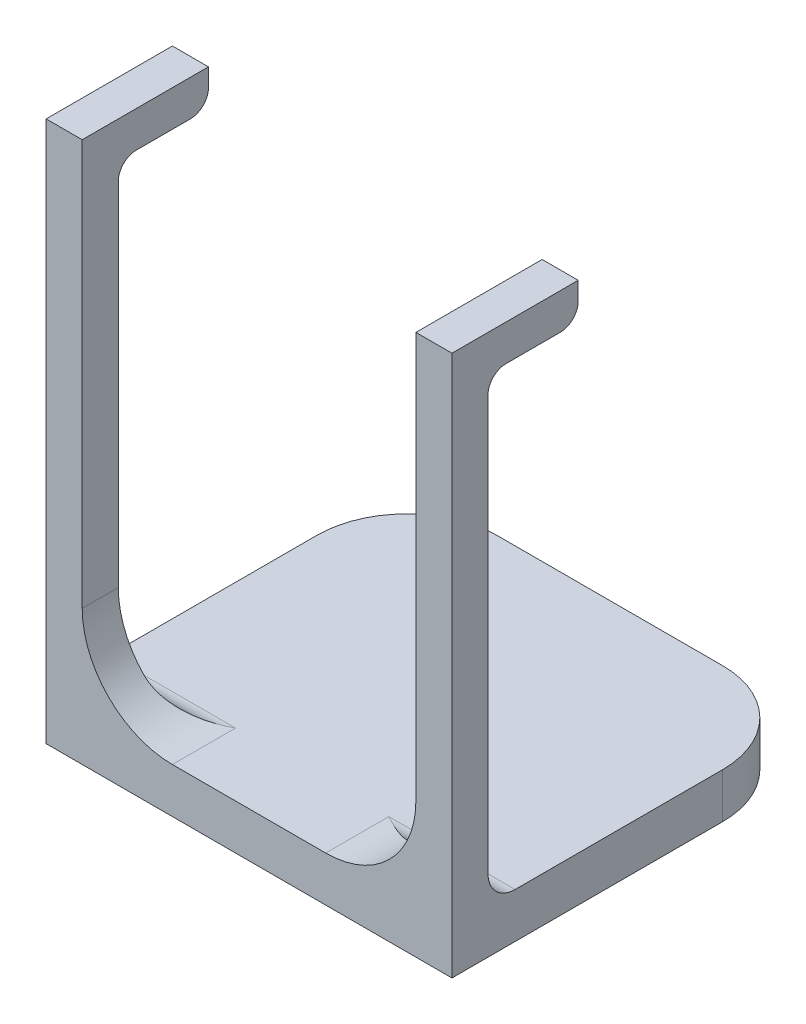
ISO-10303-21;
HEADER;
FILE_DESCRIPTION(('STEP AP214'),'2;1');
FILE_NAME('part.step','',(''),(''),'','','');
FILE_SCHEMA(('AUTOMOTIVE_DESIGN { 1 0 10303 214 1 1 1 1 }'));
ENDSEC;
DATA;
#1=APPLICATION_CONTEXT('core data for automotive mechanical design processes');
#2=APPLICATION_PROTOCOL_DEFINITION('international standard','automotive_design',2000,#1);
#3=PRODUCT_CONTEXT('',#1,'mechanical');
#4=PRODUCT('Part','Part','',(#3));
#5=PRODUCT_RELATED_PRODUCT_CATEGORY('part','',(#4));
#6=PRODUCT_DEFINITION_FORMATION('','',#4);
#7=PRODUCT_DEFINITION_CONTEXT('part definition',#1,'design');
#8=PRODUCT_DEFINITION('design','',#6,#7);
#9=PRODUCT_DEFINITION_SHAPE('','',#8);
#10=(LENGTH_UNIT() NAMED_UNIT(*) SI_UNIT(.MILLI.,.METRE.));
#11=(NAMED_UNIT(*) PLANE_ANGLE_UNIT() SI_UNIT($,.RADIAN.));
#12=(NAMED_UNIT(*) SI_UNIT($,.STERADIAN.) SOLID_ANGLE_UNIT());
#13=UNCERTAINTY_MEASURE_WITH_UNIT(LENGTH_MEASURE(1.E-05),#10,'distance_accuracy_value','');
#14=(GEOMETRIC_REPRESENTATION_CONTEXT(3) GLOBAL_UNCERTAINTY_ASSIGNED_CONTEXT((#13)) GLOBAL_UNIT_ASSIGNED_CONTEXT((#10,
#11,#12)) REPRESENTATION_CONTEXT('',''));
#15=CARTESIAN_POINT('',(0.,0.,0.));
#16=DIRECTION('',(0.,0.,1.));
#17=DIRECTION('',(1.,0.,0.));
#18=AXIS2_PLACEMENT_3D('',#15,#16,#17);
#19=CARTESIAN_POINT('',(18.5,60.,16.));
#20=DIRECTION('',(0.,0.,1.));
#21=DIRECTION('',(1.,0.,0.));
#22=AXIS2_PLACEMENT_3D('',#19,#20,#21);
#23=PLANE('',#22);
#24=DIRECTION('',(0.,-1.,0.));
#25=VECTOR('',#24,1.);
#26=CARTESIAN_POINT('',(22.5,60.,16.));
#27=LINE('',#26,#25);
#28=CARTESIAN_POINT('',(22.5,54.,16.));
#29=VERTEX_POINT('',#28);
#30=CARTESIAN_POINT('',(22.5,8.,16.));
#31=VERTEX_POINT('',#30);
#32=EDGE_CURVE('E253',#29,#31,#27,.T.);
#33=ORIENTED_EDGE('',*,*,#32,.T.);
#34=DIRECTION('',(-1.,0.,0.));
#35=VECTOR('',#34,1.);
#36=CARTESIAN_POINT('',(18.5,8.,16.));
#37=LINE('',#36,#35);
#38=CARTESIAN_POINT('',(15.6414284285428,8.,16.));
#39=VERTEX_POINT('',#38);
#40=EDGE_CURVE('E361',#31,#39,#37,.T.);
#41=ORIENTED_EDGE('',*,*,#40,.T.);
#42=CARTESIAN_POINT('',(8.49999999999999,15.,16.));
#43=DIRECTION('',(0.,0.,1.));
#44=DIRECTION('',(1.,0.,0.));
#45=AXIS2_PLACEMENT_3D('',#42,#43,#44);
#46=CIRCLE('',#45,10.);
#47=CARTESIAN_POINT('',(18.5,15.,16.));
#48=VERTEX_POINT('',#47);
#49=EDGE_CURVE('E312',#39,#48,#46,.T.);
#50=ORIENTED_EDGE('',*,*,#49,.T.);
#51=DIRECTION('',(0.,-1.,0.));
#52=VECTOR('',#51,1.);
#53=CARTESIAN_POINT('',(18.5,60.,16.));
#54=LINE('',#53,#52);
#55=CARTESIAN_POINT('',(18.5,54.,16.));
#56=VERTEX_POINT('',#55);
#57=EDGE_CURVE('E250',#56,#48,#54,.T.);
#58=ORIENTED_EDGE('',*,*,#57,.F.);
#59=DIRECTION('',(-1.,0.,0.));
#60=VECTOR('',#59,1.);
#61=CARTESIAN_POINT('',(22.5,54.,16.));
#62=LINE('',#61,#60);
#63=EDGE_CURVE('E324',#56,#29,#62,.F.);
#64=ORIENTED_EDGE('',*,*,#63,.T.);
#65=EDGE_LOOP('',(#33,#41,#50,#58,#64));
#66=FACE_BOUND('',#65,.T.);
#67=ADVANCED_FACE('F35',(#66),#23,.F.);
#68=CARTESIAN_POINT('',(-22.5,60.,16.));
#69=DIRECTION('',(0.,0.,1.));
#70=DIRECTION('',(1.,0.,0.));
#71=AXIS2_PLACEMENT_3D('',#68,#69,#70);
#72=PLANE('',#71);
#73=CARTESIAN_POINT('',(-8.50000000000001,15.,16.));
#74=DIRECTION('',(0.,0.,1.));
#75=DIRECTION('',(1.,0.,0.));
#76=AXIS2_PLACEMENT_3D('',#73,#74,#75);
#77=CIRCLE('',#76,10.);
#78=CARTESIAN_POINT('',(-18.5,15.,16.));
#79=VERTEX_POINT('',#78);
#80=CARTESIAN_POINT('',(-15.6414284285429,8.,16.));
#81=VERTEX_POINT('',#80);
#82=EDGE_CURVE('E314',#79,#81,#77,.T.);
#83=ORIENTED_EDGE('',*,*,#82,.T.);
#84=DIRECTION('',(-1.,0.,0.));
#85=VECTOR('',#84,1.);
#86=CARTESIAN_POINT('',(-22.5,8.,16.));
#87=LINE('',#86,#85);
#88=CARTESIAN_POINT('',(-22.5,8.,16.));
#89=VERTEX_POINT('',#88);
#90=EDGE_CURVE('E353',#81,#89,#87,.T.);
#91=ORIENTED_EDGE('',*,*,#90,.T.);
#92=DIRECTION('',(0.,-1.,0.));
#93=VECTOR('',#92,1.);
#94=CARTESIAN_POINT('',(-22.5,60.,16.));
#95=LINE('',#94,#93);
#96=CARTESIAN_POINT('',(-22.5,54.,16.));
#97=VERTEX_POINT('',#96);
#98=EDGE_CURVE('E264',#97,#89,#95,.T.);
#99=ORIENTED_EDGE('',*,*,#98,.F.);
#100=DIRECTION('',(-1.,0.,0.));
#101=VECTOR('',#100,1.);
#102=CARTESIAN_POINT('',(-18.5,54.,16.));
#103=LINE('',#102,#101);
#104=CARTESIAN_POINT('',(-18.5,54.,16.));
#105=VERTEX_POINT('',#104);
#106=EDGE_CURVE('E331',#97,#105,#103,.F.);
#107=ORIENTED_EDGE('',*,*,#106,.T.);
#108=DIRECTION('',(0.,-1.,0.));
#109=VECTOR('',#108,1.);
#110=CARTESIAN_POINT('',(-18.5,60.,16.));
#111=LINE('',#110,#109);
#112=EDGE_CURVE('E267',#105,#79,#111,.T.);
#113=ORIENTED_EDGE('',*,*,#112,.T.);
#114=EDGE_LOOP('',(#83,#91,#99,#107,#113));
#115=FACE_BOUND('',#114,.T.);
#116=ADVANCED_FACE('F415',(#115),#72,.F.);
#117=CARTESIAN_POINT('',(0.,5.,0.));
#118=DIRECTION('',(0.,1.,0.));
#119=DIRECTION('',(0.,0.,1.));
#120=AXIS2_PLACEMENT_3D('',#117,#118,#119);
#121=PLANE('',#120);
#122=DIRECTION('',(-1.,0.,0.));
#123=VECTOR('',#122,1.);
#124=CARTESIAN_POINT('',(22.5,5.,-20.));
#125=LINE('',#124,#123);
#126=CARTESIAN_POINT('',(12.5,5.,-20.));
#127=VERTEX_POINT('',#126);
#128=CARTESIAN_POINT('',(-12.5,5.,-20.));
#129=VERTEX_POINT('',#128);
#130=EDGE_CURVE('E287',#127,#129,#125,.T.);
#131=ORIENTED_EDGE('',*,*,#130,.T.);
#132=CARTESIAN_POINT('',(-12.5,5.,-9.99999999999999));
#133=DIRECTION('',(0.,1.,0.));
#134=DIRECTION('',(0.,0.,1.));
#135=AXIS2_PLACEMENT_3D('',#132,#133,#134);
#136=CIRCLE('',#135,10.);
#137=CARTESIAN_POINT('',(-22.5,5.,-9.99999999999999));
#138=VERTEX_POINT('',#137);
#139=EDGE_CURVE('E43',#129,#138,#136,.T.);
#140=ORIENTED_EDGE('',*,*,#139,.T.);
#141=DIRECTION('',(0.,0.,1.));
#142=VECTOR('',#141,1.);
#143=CARTESIAN_POINT('',(-22.5,5.,20.));
#144=LINE('',#143,#142);
#145=CARTESIAN_POINT('',(-22.5,5.,13.));
#146=VERTEX_POINT('',#145);
#147=EDGE_CURVE('E279',#138,#146,#144,.T.);
#148=ORIENTED_EDGE('',*,*,#147,.T.);
#149=DIRECTION('',(-1.,0.,0.));
#150=VECTOR('',#149,1.);
#151=CARTESIAN_POINT('',(0.,5.,13.));
#152=LINE('',#151,#150);
#153=CARTESIAN_POINT('',(-8.50000000000001,5.,13.));
#154=VERTEX_POINT('',#153);
#155=EDGE_CURVE('E358',#146,#154,#152,.F.);
#156=ORIENTED_EDGE('',*,*,#155,.T.);
#157=DIRECTION('',(0.,0.,-1.));
#158=VECTOR('',#157,1.);
#159=CARTESIAN_POINT('',(-8.50000000000002,5.,0.));
#160=LINE('',#159,#158);
#161=CARTESIAN_POINT('',(-8.5,5.,20.));
#162=VERTEX_POINT('',#161);
#163=EDGE_CURVE('E303',#154,#162,#160,.F.);
#164=ORIENTED_EDGE('',*,*,#163,.T.);
#165=DIRECTION('',(1.,0.,0.));
#166=VECTOR('',#165,1.);
#167=CARTESIAN_POINT('',(22.5,5.,20.));
#168=LINE('',#167,#166);
#169=CARTESIAN_POINT('',(8.49999999999999,5.,20.));
#170=VERTEX_POINT('',#169);
#171=EDGE_CURVE('E281',#162,#170,#168,.T.);
#172=ORIENTED_EDGE('',*,*,#171,.T.);
#173=DIRECTION('',(0.,0.,1.));
#174=VECTOR('',#173,1.);
#175=CARTESIAN_POINT('',(8.50000000000001,5.,0.));
#176=LINE('',#175,#174);
#177=CARTESIAN_POINT('',(8.49999999999999,5.,13.));
#178=VERTEX_POINT('',#177);
#179=EDGE_CURVE('E305',#170,#178,#176,.F.);
#180=ORIENTED_EDGE('',*,*,#179,.T.);
#181=DIRECTION('',(-1.,0.,0.));
#182=VECTOR('',#181,1.);
#183=CARTESIAN_POINT('',(0.,5.,13.));
#184=LINE('',#183,#182);
#185=CARTESIAN_POINT('',(22.5,5.,13.));
#186=VERTEX_POINT('',#185);
#187=EDGE_CURVE('E356',#178,#186,#184,.F.);
#188=ORIENTED_EDGE('',*,*,#187,.T.);
#189=DIRECTION('',(0.,0.,-1.));
#190=VECTOR('',#189,1.);
#191=CARTESIAN_POINT('',(22.5,5.,20.));
#192=LINE('',#191,#190);
#193=CARTESIAN_POINT('',(22.5,5.,-10.));
#194=VERTEX_POINT('',#193);
#195=EDGE_CURVE('E285',#186,#194,#192,.T.);
#196=ORIENTED_EDGE('',*,*,#195,.T.);
#197=CARTESIAN_POINT('',(12.5,5.,-10.));
#198=DIRECTION('',(0.,1.,0.));
#199=DIRECTION('',(0.,0.,1.));
#200=AXIS2_PLACEMENT_3D('',#197,#198,#199);
#201=CIRCLE('',#200,10.);
#202=EDGE_CURVE('E486',#194,#127,#201,.T.);
#203=ORIENTED_EDGE('',*,*,#202,.T.);
#204=EDGE_LOOP('',(#131,#140,#148,#156,#164,#172,#180,#188,#196,#203));
#205=FACE_BOUND('',#204,.T.);
#206=ADVANCED_FACE('F421',(#205),#121,.T.);
#207=CARTESIAN_POINT('',(-22.5,5.,20.));
#208=DIRECTION('',(1.,0.,0.));
#209=DIRECTION('',(0.,0.,-1.));
#210=AXIS2_PLACEMENT_3D('',#207,#208,#209);
#211=PLANE('',#210);
#212=ORIENTED_EDGE('',*,*,#147,.F.);
#213=DIRECTION('',(0.,-1.,0.));
#214=VECTOR('',#213,1.);
#215=CARTESIAN_POINT('',(-22.5,5.,-9.99999999999999));
#216=LINE('',#215,#214);
#217=CARTESIAN_POINT('',(-22.5,0.,-9.99999999999999));
#218=VERTEX_POINT('',#217);
#219=EDGE_CURVE('E469',#138,#218,#216,.T.);
#220=ORIENTED_EDGE('',*,*,#219,.T.);
#221=DIRECTION('',(0.,0.,1.));
#222=VECTOR('',#221,1.);
#223=CARTESIAN_POINT('',(-22.5,0.,20.));
#224=LINE('',#223,#222);
#225=CARTESIAN_POINT('',(-22.5,0.,20.));
#226=VERTEX_POINT('',#225);
#227=EDGE_CURVE('E276',#218,#226,#224,.T.);
#228=ORIENTED_EDGE('',*,*,#227,.T.);
#229=DIRECTION('',(0.,-1.,0.));
#230=VECTOR('',#229,1.);
#231=CARTESIAN_POINT('',(-22.5,5.,20.));
#232=LINE('',#231,#230);
#233=CARTESIAN_POINT('',(-22.5,60.,20.));
#234=VERTEX_POINT('',#233);
#235=EDGE_CURVE('E298',#234,#226,#232,.T.);
#236=ORIENTED_EDGE('',*,*,#235,.F.);
#237=DIRECTION('',(0.,0.,1.));
#238=VECTOR('',#237,1.);
#239=CARTESIAN_POINT('',(-22.5,60.,20.));
#240=LINE('',#239,#238);
#241=CARTESIAN_POINT('',(-22.5,60.,6.));
#242=VERTEX_POINT('',#241);
#243=EDGE_CURVE('E257',#242,#234,#240,.T.);
#244=ORIENTED_EDGE('',*,*,#243,.F.);
#245=DIRECTION('',(0.,1.,0.));
#246=VECTOR('',#245,1.);
#247=CARTESIAN_POINT('',(-22.5,60.,6.));
#248=LINE('',#247,#246);
#249=CARTESIAN_POINT('',(-22.5,58.,6.));
#250=VERTEX_POINT('',#249);
#251=EDGE_CURVE('E235',#250,#242,#248,.T.);
#252=ORIENTED_EDGE('',*,*,#251,.F.);
#253=CARTESIAN_POINT('',(-22.5,58.,8.));
#254=DIRECTION('',(1.,0.,0.));
#255=DIRECTION('',(0.,0.,-1.));
#256=AXIS2_PLACEMENT_3D('',#253,#254,#255);
#257=CIRCLE('',#256,2.);
#258=CARTESIAN_POINT('',(-22.5,56.,8.));
#259=VERTEX_POINT('',#258);
#260=EDGE_CURVE('E341',#250,#259,#257,.F.);
#261=ORIENTED_EDGE('',*,*,#260,.T.);
#262=DIRECTION('',(0.,0.,1.));
#263=VECTOR('',#262,1.);
#264=CARTESIAN_POINT('',(-22.5,56.,6.));
#265=LINE('',#264,#263);
#266=CARTESIAN_POINT('',(-22.5,56.,14.));
#267=VERTEX_POINT('',#266);
#268=EDGE_CURVE('E243',#259,#267,#265,.T.);
#269=ORIENTED_EDGE('',*,*,#268,.T.);
#270=CARTESIAN_POINT('',(-22.5,54.,14.));
#271=DIRECTION('',(1.,0.,0.));
#272=DIRECTION('',(0.,0.,-1.));
#273=AXIS2_PLACEMENT_3D('',#270,#271,#272);
#274=CIRCLE('',#273,2.);
#275=EDGE_CURVE('E349',#267,#97,#274,.T.);
#276=ORIENTED_EDGE('',*,*,#275,.T.);
#277=ORIENTED_EDGE('',*,*,#98,.T.);
#278=CARTESIAN_POINT('',(-22.5,8.,13.));
#279=DIRECTION('',(1.,0.,0.));
#280=DIRECTION('',(0.,0.,-1.));
#281=AXIS2_PLACEMENT_3D('',#278,#279,#280);
#282=CIRCLE('',#281,3.);
#283=EDGE_CURVE('E364',#89,#146,#282,.T.);
#284=ORIENTED_EDGE('',*,*,#283,.T.);
#285=EDGE_LOOP('',(#212,#220,#228,#236,#244,#252,#261,#269,#276,#277,#284));
#286=FACE_BOUND('',#285,.T.);
#287=ADVANCED_FACE('F448',(#286),#211,.F.);
#288=CARTESIAN_POINT('',(22.5,5.,20.));
#289=DIRECTION('',(0.,0.,-1.));
#290=DIRECTION('',(-1.,0.,0.));
#291=AXIS2_PLACEMENT_3D('',#288,#289,#290);
#292=PLANE('',#291);
#293=DIRECTION('',(1.,0.,0.));
#294=VECTOR('',#293,1.);
#295=CARTESIAN_POINT('',(22.5,0.,20.));
#296=LINE('',#295,#294);
#297=CARTESIAN_POINT('',(22.5,0.,20.));
#298=VERTEX_POINT('',#297);
#299=EDGE_CURVE('E291',#226,#298,#296,.T.);
#300=ORIENTED_EDGE('',*,*,#299,.T.);
#301=DIRECTION('',(0.,-1.,0.));
#302=VECTOR('',#301,1.);
#303=CARTESIAN_POINT('',(22.5,5.,20.));
#304=LINE('',#303,#302);
#305=CARTESIAN_POINT('',(22.5,60.,20.));
#306=VERTEX_POINT('',#305);
#307=EDGE_CURVE('E289',#306,#298,#304,.T.);
#308=ORIENTED_EDGE('',*,*,#307,.F.);
#309=DIRECTION('',(1.,0.,0.));
#310=VECTOR('',#309,1.);
#311=CARTESIAN_POINT('',(18.5,60.,20.));
#312=LINE('',#311,#310);
#313=CARTESIAN_POINT('',(18.5,60.,20.));
#314=VERTEX_POINT('',#313);
#315=EDGE_CURVE('E220',#314,#306,#312,.T.);
#316=ORIENTED_EDGE('',*,*,#315,.F.);
#317=DIRECTION('',(0.,-1.,0.));
#318=VECTOR('',#317,1.);
#319=CARTESIAN_POINT('',(18.5,60.,20.));
#320=LINE('',#319,#318);
#321=CARTESIAN_POINT('',(18.5,15.,20.));
#322=VERTEX_POINT('',#321);
#323=EDGE_CURVE('E217',#314,#322,#320,.T.);
#324=ORIENTED_EDGE('',*,*,#323,.T.);
#325=CARTESIAN_POINT('',(8.49999999999999,15.,20.));
#326=DIRECTION('',(0.,0.,-1.));
#327=DIRECTION('',(-1.,0.,0.));
#328=AXIS2_PLACEMENT_3D('',#325,#326,#327);
#329=CIRCLE('',#328,10.);
#330=EDGE_CURVE('E310',#322,#170,#329,.T.);
#331=ORIENTED_EDGE('',*,*,#330,.T.);
#332=ORIENTED_EDGE('',*,*,#171,.F.);
#333=CARTESIAN_POINT('',(-8.50000000000001,15.,20.));
#334=DIRECTION('',(0.,0.,-1.));
#335=DIRECTION('',(-1.,0.,0.));
#336=AXIS2_PLACEMENT_3D('',#333,#334,#335);
#337=CIRCLE('',#336,10.);
#338=CARTESIAN_POINT('',(-18.5,15.,20.));
#339=VERTEX_POINT('',#338);
#340=EDGE_CURVE('E317',#162,#339,#337,.T.);
#341=ORIENTED_EDGE('',*,*,#340,.T.);
#342=DIRECTION('',(0.,-1.,0.));
#343=VECTOR('',#342,1.);
#344=CARTESIAN_POINT('',(-18.5,60.,20.));
#345=LINE('',#344,#343);
#346=CARTESIAN_POINT('',(-18.5,60.,20.));
#347=VERTEX_POINT('',#346);
#348=EDGE_CURVE('E269',#347,#339,#345,.T.);
#349=ORIENTED_EDGE('',*,*,#348,.F.);
#350=DIRECTION('',(1.,0.,0.));
#351=VECTOR('',#350,1.);
#352=CARTESIAN_POINT('',(-22.5,60.,20.));
#353=LINE('',#352,#351);
#354=EDGE_CURVE('E260',#234,#347,#353,.T.);
#355=ORIENTED_EDGE('',*,*,#354,.F.);
#356=ORIENTED_EDGE('',*,*,#235,.T.);
#357=EDGE_LOOP('',(#300,#308,#316,#324,#331,#332,#341,#349,#355,#356));
#358=FACE_BOUND('',#357,.T.);
#359=ADVANCED_FACE('F459',(#358),#292,.F.);
#360=CARTESIAN_POINT('',(22.5,5.,20.));
#361=DIRECTION('',(-1.,0.,0.));
#362=DIRECTION('',(0.,0.,1.));
#363=AXIS2_PLACEMENT_3D('',#360,#361,#362);
#364=PLANE('',#363);
#365=DIRECTION('',(0.,0.,-1.));
#366=VECTOR('',#365,1.);
#367=CARTESIAN_POINT('',(22.5,0.,20.));
#368=LINE('',#367,#366);
#369=CARTESIAN_POINT('',(22.5,0.,-10.));
#370=VERTEX_POINT('',#369);
#371=EDGE_CURVE('E293',#298,#370,#368,.T.);
#372=ORIENTED_EDGE('',*,*,#371,.T.);
#373=DIRECTION('',(0.,-1.,0.));
#374=VECTOR('',#373,1.);
#375=CARTESIAN_POINT('',(22.5,5.,-10.));
#376=LINE('',#375,#374);
#377=EDGE_CURVE('E11',#370,#194,#376,.F.);
#378=ORIENTED_EDGE('',*,*,#377,.T.);
#379=ORIENTED_EDGE('',*,*,#195,.F.);
#380=CARTESIAN_POINT('',(22.5,8.,13.));
#381=DIRECTION('',(-1.,0.,0.));
#382=DIRECTION('',(0.,0.,1.));
#383=AXIS2_PLACEMENT_3D('',#380,#381,#382);
#384=CIRCLE('',#383,3.);
#385=EDGE_CURVE('E477',#186,#31,#384,.T.);
#386=ORIENTED_EDGE('',*,*,#385,.T.);
#387=ORIENTED_EDGE('',*,*,#32,.F.);
#388=CARTESIAN_POINT('',(22.5,54.,14.));
#389=DIRECTION('',(-1.,0.,0.));
#390=DIRECTION('',(0.,0.,1.));
#391=AXIS2_PLACEMENT_3D('',#388,#389,#390);
#392=CIRCLE('',#391,2.);
#393=CARTESIAN_POINT('',(22.5,56.,14.));
#394=VERTEX_POINT('',#393);
#395=EDGE_CURVE('E347',#29,#394,#392,.T.);
#396=ORIENTED_EDGE('',*,*,#395,.T.);
#397=DIRECTION('',(0.,0.,1.));
#398=VECTOR('',#397,1.);
#399=CARTESIAN_POINT('',(22.5,56.,6.));
#400=LINE('',#399,#398);
#401=CARTESIAN_POINT('',(22.5,56.,8.));
#402=VERTEX_POINT('',#401);
#403=EDGE_CURVE('E229',#402,#394,#400,.T.);
#404=ORIENTED_EDGE('',*,*,#403,.F.);
#405=CARTESIAN_POINT('',(22.5,58.,8.));
#406=DIRECTION('',(-1.,0.,0.));
#407=DIRECTION('',(0.,0.,1.));
#408=AXIS2_PLACEMENT_3D('',#405,#406,#407);
#409=CIRCLE('',#408,2.);
#410=CARTESIAN_POINT('',(22.5,58.,6.));
#411=VERTEX_POINT('',#410);
#412=EDGE_CURVE('E336',#402,#411,#409,.F.);
#413=ORIENTED_EDGE('',*,*,#412,.T.);
#414=DIRECTION('',(0.,-1.,0.));
#415=VECTOR('',#414,1.);
#416=CARTESIAN_POINT('',(22.5,60.,6.));
#417=LINE('',#416,#415);
#418=CARTESIAN_POINT('',(22.5,60.,6.));
#419=VERTEX_POINT('',#418);
#420=EDGE_CURVE('E209',#419,#411,#417,.T.);
#421=ORIENTED_EDGE('',*,*,#420,.F.);
#422=DIRECTION('',(0.,0.,-1.));
#423=VECTOR('',#422,1.);
#424=CARTESIAN_POINT('',(22.5,60.,20.));
#425=LINE('',#424,#423);
#426=EDGE_CURVE('E225',#306,#419,#425,.T.);
#427=ORIENTED_EDGE('',*,*,#426,.F.);
#428=ORIENTED_EDGE('',*,*,#307,.T.);
#429=EDGE_LOOP('',(#372,#378,#379,#386,#387,#396,#404,#413,#421,#427,#428));
#430=FACE_BOUND('',#429,.T.);
#431=ADVANCED_FACE('F456',(#430),#364,.F.);
#432=CARTESIAN_POINT('',(22.5,5.,-20.));
#433=DIRECTION('',(0.,0.,1.));
#434=DIRECTION('',(1.,0.,0.));
#435=AXIS2_PLACEMENT_3D('',#432,#433,#434);
#436=PLANE('',#435);
#437=DIRECTION('',(-1.,0.,0.));
#438=VECTOR('',#437,1.);
#439=CARTESIAN_POINT('',(22.5,0.,-20.));
#440=LINE('',#439,#438);
#441=CARTESIAN_POINT('',(12.5,0.,-20.));
#442=VERTEX_POINT('',#441);
#443=CARTESIAN_POINT('',(-12.5,0.,-20.));
#444=VERTEX_POINT('',#443);
#445=EDGE_CURVE('E282',#442,#444,#440,.T.);
#446=ORIENTED_EDGE('',*,*,#445,.T.);
#447=DIRECTION('',(0.,-1.,0.));
#448=VECTOR('',#447,1.);
#449=CARTESIAN_POINT('',(-12.5,5.,-20.));
#450=LINE('',#449,#448);
#451=EDGE_CURVE('E56',#444,#129,#450,.F.);
#452=ORIENTED_EDGE('',*,*,#451,.T.);
#453=ORIENTED_EDGE('',*,*,#130,.F.);
#454=DIRECTION('',(0.,-1.,0.));
#455=VECTOR('',#454,1.);
#456=CARTESIAN_POINT('',(12.5,5.,-20.));
#457=LINE('',#456,#455);
#458=EDGE_CURVE('E482',#127,#442,#457,.T.);
#459=ORIENTED_EDGE('',*,*,#458,.T.);
#460=EDGE_LOOP('',(#446,#452,#453,#459));
#461=FACE_BOUND('',#460,.T.);
#462=ADVANCED_FACE('F452',(#461),#436,.F.);
#463=CARTESIAN_POINT('',(0.,0.,0.));
#464=DIRECTION('',(0.,1.,0.));
#465=DIRECTION('',(0.,0.,1.));
#466=AXIS2_PLACEMENT_3D('',#463,#464,#465);
#467=PLANE('',#466);
#468=CARTESIAN_POINT('',(0.,0.,0.));
#469=DIRECTION('',(0.,-1.,0.));
#470=DIRECTION('',(0.,0.,-1.));
#471=AXIS2_PLACEMENT_3D('',#468,#469,#470);
#472=CIRCLE('',#471,12.7);
#473=CARTESIAN_POINT('',(0.,0.,-12.7));
#474=VERTEX_POINT('',#473);
#475=EDGE_CURVE('E272',#474,#474,#472,.T.);
#476=ORIENTED_EDGE('',*,*,#475,.F.);
#477=EDGE_LOOP('',(#476));
#478=FACE_BOUND('',#477,.T.);
#479=ORIENTED_EDGE('',*,*,#227,.F.);
#480=CARTESIAN_POINT('',(-12.5,0.,-9.99999999999999));
#481=DIRECTION('',(0.,1.,0.));
#482=DIRECTION('',(0.,0.,1.));
#483=AXIS2_PLACEMENT_3D('',#480,#481,#482);
#484=CIRCLE('',#483,10.);
#485=EDGE_CURVE('E475',#218,#444,#484,.F.);
#486=ORIENTED_EDGE('',*,*,#485,.T.);
#487=ORIENTED_EDGE('',*,*,#445,.F.);
#488=CARTESIAN_POINT('',(12.5,0.,-10.));
#489=DIRECTION('',(0.,1.,0.));
#490=DIRECTION('',(0.,0.,1.));
#491=AXIS2_PLACEMENT_3D('',#488,#489,#490);
#492=CIRCLE('',#491,10.);
#493=EDGE_CURVE('E476',#442,#370,#492,.F.);
#494=ORIENTED_EDGE('',*,*,#493,.T.);
#495=ORIENTED_EDGE('',*,*,#371,.F.);
#496=ORIENTED_EDGE('',*,*,#299,.F.);
#497=EDGE_LOOP('',(#479,#486,#487,#494,#495,#496));
#498=FACE_BOUND('',#497,.T.);
#499=ADVANCED_FACE('F444',(#478,#498),#467,.F.);
#500=CARTESIAN_POINT('',(0.,3.2,0.));
#501=DIRECTION('',(0.,-1.,0.));
#502=DIRECTION('',(0.,0.,-1.));
#503=AXIS2_PLACEMENT_3D('',#500,#501,#502);
#504=CYLINDRICAL_SURFACE('',#503,12.7);
#505=CARTESIAN_POINT('',(0.,3.2,0.));
#506=DIRECTION('',(0.,-1.,0.));
#507=DIRECTION('',(0.,0.,-1.));
#508=AXIS2_PLACEMENT_3D('',#505,#506,#507);
#509=CIRCLE('',#508,12.7);
#510=CARTESIAN_POINT('',(0.,3.2,-12.7));
#511=VERTEX_POINT('',#510);
#512=EDGE_CURVE('E273',#511,#511,#509,.T.);
#513=ORIENTED_EDGE('',*,*,#512,.F.);
#514=EDGE_LOOP('',(#513));
#515=FACE_BOUND('',#514,.T.);
#516=ORIENTED_EDGE('',*,*,#475,.T.);
#517=EDGE_LOOP('',(#516));
#518=FACE_BOUND('',#517,.T.);
#519=ADVANCED_FACE('F440',(#515,#518),#504,.F.);
#520=CARTESIAN_POINT('',(0.,3.2,0.));
#521=DIRECTION('',(0.,-1.,0.));
#522=DIRECTION('',(0.,0.,-1.));
#523=AXIS2_PLACEMENT_3D('',#520,#521,#522);
#524=PLANE('',#523);
#525=ORIENTED_EDGE('',*,*,#512,.T.);
#526=EDGE_LOOP('',(#525));
#527=FACE_BOUND('',#526,.T.);
#528=ADVANCED_FACE('F436',(#527),#524,.T.);
#529=CARTESIAN_POINT('',(-18.5,60.,20.));
#530=DIRECTION('',(-1.,0.,0.));
#531=DIRECTION('',(0.,0.,1.));
#532=AXIS2_PLACEMENT_3D('',#529,#530,#531);
#533=PLANE('',#532);
#534=DIRECTION('',(0.,0.,1.));
#535=VECTOR('',#534,1.);
#536=CARTESIAN_POINT('',(-18.5,56.,6.));
#537=LINE('',#536,#535);
#538=CARTESIAN_POINT('',(-18.5,56.,8.));
#539=VERTEX_POINT('',#538);
#540=CARTESIAN_POINT('',(-18.5,56.,14.));
#541=VERTEX_POINT('',#540);
#542=EDGE_CURVE('E221',#539,#541,#537,.T.);
#543=ORIENTED_EDGE('',*,*,#542,.F.);
#544=CARTESIAN_POINT('',(-18.5,58.,8.));
#545=DIRECTION('',(-1.,0.,0.));
#546=DIRECTION('',(0.,0.,1.));
#547=AXIS2_PLACEMENT_3D('',#544,#545,#546);
#548=CIRCLE('',#547,2.);
#549=CARTESIAN_POINT('',(-18.5,58.,6.));
#550=VERTEX_POINT('',#549);
#551=EDGE_CURVE('E343',#539,#550,#548,.F.);
#552=ORIENTED_EDGE('',*,*,#551,.T.);
#553=DIRECTION('',(0.,-1.,0.));
#554=VECTOR('',#553,1.);
#555=CARTESIAN_POINT('',(-18.5,60.,6.));
#556=LINE('',#555,#554);
#557=CARTESIAN_POINT('',(-18.5,60.,6.));
#558=VERTEX_POINT('',#557);
#559=EDGE_CURVE('E240',#558,#550,#556,.T.);
#560=ORIENTED_EDGE('',*,*,#559,.F.);
#561=DIRECTION('',(0.,0.,-1.));
#562=VECTOR('',#561,1.);
#563=CARTESIAN_POINT('',(-18.5,60.,20.));
#564=LINE('',#563,#562);
#565=EDGE_CURVE('E262',#347,#558,#564,.T.);
#566=ORIENTED_EDGE('',*,*,#565,.F.);
#567=ORIENTED_EDGE('',*,*,#348,.T.);
#568=DIRECTION('',(0.,0.,-1.));
#569=VECTOR('',#568,1.);
#570=CARTESIAN_POINT('',(-18.5,15.,20.));
#571=LINE('',#570,#569);
#572=EDGE_CURVE('E307',#339,#79,#571,.T.);
#573=ORIENTED_EDGE('',*,*,#572,.T.);
#574=ORIENTED_EDGE('',*,*,#112,.F.);
#575=CARTESIAN_POINT('',(-18.5,54.,14.));
#576=DIRECTION('',(-1.,0.,0.));
#577=DIRECTION('',(0.,0.,1.));
#578=AXIS2_PLACEMENT_3D('',#575,#576,#577);
#579=CIRCLE('',#578,2.);
#580=EDGE_CURVE('E351',#105,#541,#579,.T.);
#581=ORIENTED_EDGE('',*,*,#580,.T.);
#582=EDGE_LOOP('',(#543,#552,#560,#566,#567,#573,#574,#581));
#583=FACE_BOUND('',#582,.T.);
#584=ADVANCED_FACE('F431',(#583),#533,.F.);
#585=CARTESIAN_POINT('',(0.,60.,0.));
#586=DIRECTION('',(0.,-1.,0.));
#587=DIRECTION('',(0.,0.,-1.));
#588=AXIS2_PLACEMENT_3D('',#585,#586,#587);
#589=PLANE('',#588);
#590=ORIENTED_EDGE('',*,*,#243,.T.);
#591=ORIENTED_EDGE('',*,*,#354,.T.);
#592=ORIENTED_EDGE('',*,*,#565,.T.);
#593=DIRECTION('',(1.,0.,0.));
#594=VECTOR('',#593,1.);
#595=CARTESIAN_POINT('',(-22.5,60.,6.));
#596=LINE('',#595,#594);
#597=EDGE_CURVE('E237',#242,#558,#596,.T.);
#598=ORIENTED_EDGE('',*,*,#597,.F.);
#599=EDGE_LOOP('',(#590,#591,#592,#598));
#600=FACE_BOUND('',#599,.T.);
#601=ADVANCED_FACE('F429',(#600),#589,.F.);
#602=CARTESIAN_POINT('',(18.5,60.,20.));
#603=DIRECTION('',(1.,0.,0.));
#604=DIRECTION('',(0.,0.,-1.));
#605=AXIS2_PLACEMENT_3D('',#602,#603,#604);
#606=PLANE('',#605);
#607=DIRECTION('',(0.,1.,0.));
#608=VECTOR('',#607,1.);
#609=CARTESIAN_POINT('',(18.5,60.,6.));
#610=LINE('',#609,#608);
#611=CARTESIAN_POINT('',(18.5,58.,6.));
#612=VERTEX_POINT('',#611);
#613=CARTESIAN_POINT('',(18.5,60.,6.));
#614=VERTEX_POINT('',#613);
#615=EDGE_CURVE('E199',#612,#614,#610,.T.);
#616=ORIENTED_EDGE('',*,*,#615,.F.);
#617=CARTESIAN_POINT('',(18.5,58.,8.));
#618=DIRECTION('',(1.,0.,0.));
#619=DIRECTION('',(0.,0.,-1.));
#620=AXIS2_PLACEMENT_3D('',#617,#618,#619);
#621=CIRCLE('',#620,2.);
#622=CARTESIAN_POINT('',(18.5,56.,8.));
#623=VERTEX_POINT('',#622);
#624=EDGE_CURVE('E334',#612,#623,#621,.F.);
#625=ORIENTED_EDGE('',*,*,#624,.T.);
#626=DIRECTION('',(0.,0.,1.));
#627=VECTOR('',#626,1.);
#628=CARTESIAN_POINT('',(18.5,56.,6.));
#629=LINE('',#628,#627);
#630=CARTESIAN_POINT('',(18.5,56.,14.));
#631=VERTEX_POINT('',#630);
#632=EDGE_CURVE('E226',#623,#631,#629,.T.);
#633=ORIENTED_EDGE('',*,*,#632,.T.);
#634=CARTESIAN_POINT('',(18.5,54.,14.));
#635=DIRECTION('',(1.,0.,0.));
#636=DIRECTION('',(0.,0.,-1.));
#637=AXIS2_PLACEMENT_3D('',#634,#635,#636);
#638=CIRCLE('',#637,2.);
#639=EDGE_CURVE('E345',#631,#56,#638,.T.);
#640=ORIENTED_EDGE('',*,*,#639,.T.);
#641=ORIENTED_EDGE('',*,*,#57,.T.);
#642=DIRECTION('',(0.,0.,1.));
#643=VECTOR('',#642,1.);
#644=CARTESIAN_POINT('',(18.5,15.,20.));
#645=LINE('',#644,#643);
#646=EDGE_CURVE('E301',#48,#322,#645,.T.);
#647=ORIENTED_EDGE('',*,*,#646,.T.);
#648=ORIENTED_EDGE('',*,*,#323,.F.);
#649=DIRECTION('',(0.,0.,1.));
#650=VECTOR('',#649,1.);
#651=CARTESIAN_POINT('',(18.5,60.,20.));
#652=LINE('',#651,#650);
#653=EDGE_CURVE('E213',#614,#314,#652,.T.);
#654=ORIENTED_EDGE('',*,*,#653,.F.);
#655=EDGE_LOOP('',(#616,#625,#633,#640,#641,#647,#648,#654));
#656=FACE_BOUND('',#655,.T.);
#657=ADVANCED_FACE('F214',(#656),#606,.F.);
#658=CARTESIAN_POINT('',(0.,60.,0.));
#659=DIRECTION('',(0.,-1.,0.));
#660=DIRECTION('',(0.,0.,-1.));
#661=AXIS2_PLACEMENT_3D('',#658,#659,#660);
#662=PLANE('',#661);
#663=ORIENTED_EDGE('',*,*,#653,.T.);
#664=ORIENTED_EDGE('',*,*,#315,.T.);
#665=ORIENTED_EDGE('',*,*,#426,.T.);
#666=DIRECTION('',(1.,0.,0.));
#667=VECTOR('',#666,1.);
#668=CARTESIAN_POINT('',(22.5,60.,6.));
#669=LINE('',#668,#667);
#670=EDGE_CURVE('E204',#614,#419,#669,.T.);
#671=ORIENTED_EDGE('',*,*,#670,.F.);
#672=EDGE_LOOP('',(#663,#664,#665,#671));
#673=FACE_BOUND('',#672,.T.);
#674=ADVANCED_FACE('F223',(#673),#662,.F.);
#675=CARTESIAN_POINT('',(-22.5,56.,6.));
#676=DIRECTION('',(0.,1.,0.));
#677=DIRECTION('',(0.,0.,1.));
#678=AXIS2_PLACEMENT_3D('',#675,#676,#677);
#679=PLANE('',#678);
#680=ORIENTED_EDGE('',*,*,#542,.T.);
#681=DIRECTION('',(-1.,0.,0.));
#682=VECTOR('',#681,1.);
#683=CARTESIAN_POINT('',(-22.5,56.,14.));
#684=LINE('',#683,#682);
#685=EDGE_CURVE('E328',#541,#267,#684,.T.);
#686=ORIENTED_EDGE('',*,*,#685,.T.);
#687=ORIENTED_EDGE('',*,*,#268,.F.);
#688=DIRECTION('',(-1.,0.,0.));
#689=VECTOR('',#688,1.);
#690=CARTESIAN_POINT('',(-22.5,56.,8.));
#691=LINE('',#690,#689);
#692=EDGE_CURVE('E326',#259,#539,#691,.F.);
#693=ORIENTED_EDGE('',*,*,#692,.T.);
#694=EDGE_LOOP('',(#680,#686,#687,#693));
#695=FACE_BOUND('',#694,.T.);
#696=ADVANCED_FACE('F508',(#695),#679,.F.);
#697=CARTESIAN_POINT('',(0.,0.,6.));
#698=DIRECTION('',(0.,0.,1.));
#699=DIRECTION('',(1.,0.,0.));
#700=AXIS2_PLACEMENT_3D('',#697,#698,#699);
#701=PLANE('',#700);
#702=ORIENTED_EDGE('',*,*,#559,.T.);
#703=DIRECTION('',(-1.,0.,0.));
#704=VECTOR('',#703,1.);
#705=CARTESIAN_POINT('',(0.,58.,6.));
#706=LINE('',#705,#704);
#707=EDGE_CURVE('E338',#550,#250,#706,.T.);
#708=ORIENTED_EDGE('',*,*,#707,.T.);
#709=ORIENTED_EDGE('',*,*,#251,.T.);
#710=ORIENTED_EDGE('',*,*,#597,.T.);
#711=EDGE_LOOP('',(#702,#708,#709,#710));
#712=FACE_BOUND('',#711,.T.);
#713=ADVANCED_FACE('F502',(#712),#701,.F.);
#714=CARTESIAN_POINT('',(22.5,56.,6.));
#715=DIRECTION('',(0.,1.,0.));
#716=DIRECTION('',(0.,0.,1.));
#717=AXIS2_PLACEMENT_3D('',#714,#715,#716);
#718=PLANE('',#717);
#719=ORIENTED_EDGE('',*,*,#403,.T.);
#720=DIRECTION('',(-1.,0.,0.));
#721=VECTOR('',#720,1.);
#722=CARTESIAN_POINT('',(18.5,56.,14.));
#723=LINE('',#722,#721);
#724=EDGE_CURVE('E321',#394,#631,#723,.T.);
#725=ORIENTED_EDGE('',*,*,#724,.T.);
#726=ORIENTED_EDGE('',*,*,#632,.F.);
#727=DIRECTION('',(-1.,0.,0.));
#728=VECTOR('',#727,1.);
#729=CARTESIAN_POINT('',(22.5,56.,8.));
#730=LINE('',#729,#728);
#731=EDGE_CURVE('E319',#623,#402,#730,.F.);
#732=ORIENTED_EDGE('',*,*,#731,.T.);
#733=EDGE_LOOP('',(#719,#725,#726,#732));
#734=FACE_BOUND('',#733,.T.);
#735=ADVANCED_FACE('F533',(#734),#718,.F.);
#736=CARTESIAN_POINT('',(0.,0.,6.));
#737=DIRECTION('',(0.,0.,-1.));
#738=DIRECTION('',(-1.,0.,0.));
#739=AXIS2_PLACEMENT_3D('',#736,#737,#738);
#740=PLANE('',#739);
#741=ORIENTED_EDGE('',*,*,#420,.T.);
#742=DIRECTION('',(-1.,0.,0.));
#743=VECTOR('',#742,1.);
#744=CARTESIAN_POINT('',(18.5,58.,6.));
#745=LINE('',#744,#743);
#746=EDGE_CURVE('E207',#411,#612,#745,.T.);
#747=ORIENTED_EDGE('',*,*,#746,.T.);
#748=ORIENTED_EDGE('',*,*,#615,.T.);
#749=ORIENTED_EDGE('',*,*,#670,.T.);
#750=EDGE_LOOP('',(#741,#747,#748,#749));
#751=FACE_BOUND('',#750,.T.);
#752=ADVANCED_FACE('F202',(#751),#740,.T.);
#753=CARTESIAN_POINT('',(8.49999999999999,15.,20.));
#754=DIRECTION('',(0.,0.,1.));
#755=DIRECTION('',(1.,0.,0.));
#756=AXIS2_PLACEMENT_3D('',#753,#754,#755);
#757=CYLINDRICAL_SURFACE('',#756,10.);
#758=ORIENTED_EDGE('',*,*,#49,.F.);
#759=CARTESIAN_POINT('',(15.6414284285428,8.,16.));
#760=CARTESIAN_POINT('',(15.5240547312689,7.88021538100888,15.9999595784757));
#761=CARTESIAN_POINT('',(15.4037419237788,7.76353601184504,15.9928315614425));
#762=CARTESIAN_POINT('',(15.1583855799035,7.5371885550388,15.9662802609211));
#763=CARTESIAN_POINT('',(15.0333515513049,7.42750745954449,15.9468805661611));
#764=CARTESIAN_POINT('',(14.7804094097204,7.21646664373073,15.8978773363031));
#765=CARTESIAN_POINT('',(14.6525382041167,7.1150397929084,15.8683690794747));
#766=CARTESIAN_POINT('',(14.3934364767732,6.91954464733761,15.8005939377831));
#767=CARTESIAN_POINT('',(14.2622038178991,6.82548119634422,15.7623213515097));
#768=CARTESIAN_POINT('',(13.9317711428191,6.60040813991877,15.6576752122737));
#769=CARTESIAN_POINT('',(13.7308847345807,6.4739784402908,15.5867383439863));
#770=CARTESIAN_POINT('',(13.3245134746682,6.23761599756297,15.4318659303514));
#771=CARTESIAN_POINT('',(13.1190272963924,6.12768808599545,15.3479265925915));
#772=CARTESIAN_POINT('',(12.7033531381741,5.92333965389536,15.1693312768963));
#773=CARTESIAN_POINT('',(12.4931447261342,5.8290133130505,15.0746156534987));
#774=CARTESIAN_POINT('',(12.0700776072327,5.65619076759726,14.8771710066173));
#775=CARTESIAN_POINT('',(11.8572190569815,5.57769363222979,14.7744424547876));
#776=CARTESIAN_POINT('',(11.3860876609366,5.42169580979823,14.5413620558498));
#777=CARTESIAN_POINT('',(11.1273555977779,5.34762272220854,14.4096319690311));
#778=CARTESIAN_POINT('',(10.6079224072916,5.22103295337131,14.1399756164946));
#779=CARTESIAN_POINT('',(10.3472207261944,5.16852258316719,14.0020475498186));
#780=CARTESIAN_POINT('',(9.56477356042364,5.04286237257721,13.5831828823253));
#781=CARTESIAN_POINT('',(9.04068363949428,5.00093257076522,13.2961444348105));
#782=CARTESIAN_POINT('',(8.51169398908596,5.00000513322406,13.0064050550257));
#783=CARTESIAN_POINT('',(8.50584693251328,5.00000000534917,13.0032024901304));
#784=CARTESIAN_POINT('',(8.49999999999999,5.,13.));
#785=B_SPLINE_CURVE_WITH_KNOTS('',3,(#759,#760,#761,#762,#763,#764,#765,#766,#767,#768,#769,
#770,#771,#772,#773,#774,#775,#776,#777,#778,#779,#780,#781,#782,#783,#784),.UNSPECIFIED.,.F.,
.F.,(4,2,2,2,2,2,2,2,2,2,2,2,4),(0.,0.502681257877415,1.00439918142301,1.50151265730865,
1.99895044094774,2.74102058336997,3.48330757333042,4.22992365575318,4.97649582425589,
5.8744069253857,6.77258064294588,8.56196658141674,8.58196658733393),.UNSPECIFIED.);
#786=EDGE_CURVE('E375',#39,#178,#785,.T.);
#787=ORIENTED_EDGE('',*,*,#786,.T.);
#788=ORIENTED_EDGE('',*,*,#179,.F.);
#789=ORIENTED_EDGE('',*,*,#330,.F.);
#790=ORIENTED_EDGE('',*,*,#646,.F.);
#791=EDGE_LOOP('',(#758,#787,#788,#789,#790));
#792=FACE_BOUND('',#791,.T.);
#793=ADVANCED_FACE('F391',(#792),#757,.F.);
#794=CARTESIAN_POINT('',(-8.50000000000001,15.,20.));
#795=DIRECTION('',(0.,0.,-1.));
#796=DIRECTION('',(-1.,0.,0.));
#797=AXIS2_PLACEMENT_3D('',#794,#795,#796);
#798=CYLINDRICAL_SURFACE('',#797,10.);
#799=ORIENTED_EDGE('',*,*,#340,.F.);
#800=ORIENTED_EDGE('',*,*,#163,.F.);
#801=CARTESIAN_POINT('',(-15.6414284285429,8.,16.));
#802=CARTESIAN_POINT('',(-15.5240547312689,7.88021538100888,15.9999595784758));
#803=CARTESIAN_POINT('',(-15.4037419237789,7.76353601184504,15.9928315614425));
#804=CARTESIAN_POINT('',(-15.1583855799035,7.5371885550388,15.9662802609211));
#805=CARTESIAN_POINT('',(-15.0333515513049,7.42750745954449,15.9468805661611));
#806=CARTESIAN_POINT('',(-14.7804094097204,7.21646664373073,15.8978773363031));
#807=CARTESIAN_POINT('',(-14.6525382041167,7.1150397929084,15.8683690794747));
#808=CARTESIAN_POINT('',(-14.3934364767732,6.91954464733761,15.8005939377831));
#809=CARTESIAN_POINT('',(-14.2622038178991,6.82548119634422,15.7623213515097));
#810=CARTESIAN_POINT('',(-13.9317711428191,6.60040813991877,15.6576752122737));
#811=CARTESIAN_POINT('',(-13.7308847345807,6.4739784402908,15.5867383439863));
#812=CARTESIAN_POINT('',(-13.3245134746682,6.23761599756297,15.4318659303514));
#813=CARTESIAN_POINT('',(-13.1190272963924,6.12768808599545,15.3479265925915));
#814=CARTESIAN_POINT('',(-12.7033531381741,5.92333965389536,15.1693312768963));
#815=CARTESIAN_POINT('',(-12.4931447261342,5.8290133130505,15.0746156534987));
#816=CARTESIAN_POINT('',(-12.0700776072327,5.65619076759726,14.8771710066173));
#817=CARTESIAN_POINT('',(-11.8572190569816,5.57769363222979,14.7744424547876));
#818=CARTESIAN_POINT('',(-11.3860876609366,5.42169580979823,14.5413620558498));
#819=CARTESIAN_POINT('',(-11.127355597778,5.34762272220854,14.4096319690311));
#820=CARTESIAN_POINT('',(-10.6079224072916,5.22103295337131,14.1399756164946));
#821=CARTESIAN_POINT('',(-10.3472207261944,5.16852258316719,14.0020475498186));
#822=CARTESIAN_POINT('',(-9.56477356042366,5.04286237257721,13.5831828823253));
#823=CARTESIAN_POINT('',(-9.0406836394943,5.00093257076522,13.2961444348105));
#824=CARTESIAN_POINT('',(-8.51169398908598,5.00000513322406,13.0064050550257));
#825=CARTESIAN_POINT('',(-8.50584693251329,5.00000000534917,13.0032024901304));
#826=CARTESIAN_POINT('',(-8.50000000000001,5.,13.));
#827=B_SPLINE_CURVE_WITH_KNOTS('',3,(#801,#802,#803,#804,#805,#806,#807,#808,#809,#810,#811,
#812,#813,#814,#815,#816,#817,#818,#819,#820,#821,#822,#823,#824,#825,#826),.UNSPECIFIED.,.F.,
.F.,(4,2,2,2,2,2,2,2,2,2,2,2,4),(0.,0.502681257877415,1.00439918142301,1.50151265730865,
1.99895044094774,2.74102058336997,3.48330757333042,4.22992365575318,4.97649582425589,
5.8744069253857,6.77258064294588,8.56196658141674,8.58196658733393),.UNSPECIFIED.);
#828=EDGE_CURVE('E367',#154,#81,#827,.F.);
#829=ORIENTED_EDGE('',*,*,#828,.T.);
#830=ORIENTED_EDGE('',*,*,#82,.F.);
#831=ORIENTED_EDGE('',*,*,#572,.F.);
#832=EDGE_LOOP('',(#799,#800,#829,#830,#831));
#833=FACE_BOUND('',#832,.T.);
#834=ADVANCED_FACE('F386',(#833),#798,.F.);
#835=CARTESIAN_POINT('',(22.5,54.,14.));
#836=DIRECTION('',(1.,0.,0.));
#837=DIRECTION('',(0.,0.,-1.));
#838=AXIS2_PLACEMENT_3D('',#835,#836,#837);
#839=CYLINDRICAL_SURFACE('',#838,2.);
#840=ORIENTED_EDGE('',*,*,#395,.F.);
#841=ORIENTED_EDGE('',*,*,#63,.F.);
#842=ORIENTED_EDGE('',*,*,#639,.F.);
#843=ORIENTED_EDGE('',*,*,#724,.F.);
#844=EDGE_LOOP('',(#840,#841,#842,#843));
#845=FACE_BOUND('',#844,.T.);
#846=ADVANCED_FACE('F390',(#845),#839,.F.);
#847=CARTESIAN_POINT('',(-22.5,54.,14.));
#848=DIRECTION('',(1.,0.,0.));
#849=DIRECTION('',(0.,0.,-1.));
#850=AXIS2_PLACEMENT_3D('',#847,#848,#849);
#851=CYLINDRICAL_SURFACE('',#850,2.);
#852=ORIENTED_EDGE('',*,*,#580,.F.);
#853=ORIENTED_EDGE('',*,*,#106,.F.);
#854=ORIENTED_EDGE('',*,*,#275,.F.);
#855=ORIENTED_EDGE('',*,*,#685,.F.);
#856=EDGE_LOOP('',(#852,#853,#854,#855));
#857=FACE_BOUND('',#856,.T.);
#858=ADVANCED_FACE('F397',(#857),#851,.F.);
#859=CARTESIAN_POINT('',(0.,58.,8.));
#860=DIRECTION('',(1.,0.,0.));
#861=DIRECTION('',(0.,0.,-1.));
#862=AXIS2_PLACEMENT_3D('',#859,#860,#861);
#863=CYLINDRICAL_SURFACE('',#862,2.);
#864=ORIENTED_EDGE('',*,*,#412,.F.);
#865=ORIENTED_EDGE('',*,*,#731,.F.);
#866=ORIENTED_EDGE('',*,*,#624,.F.);
#867=ORIENTED_EDGE('',*,*,#746,.F.);
#868=EDGE_LOOP('',(#864,#865,#866,#867));
#869=FACE_BOUND('',#868,.T.);
#870=ADVANCED_FACE('F401',(#869),#863,.T.);
#871=CARTESIAN_POINT('',(0.,58.,8.));
#872=DIRECTION('',(-1.,0.,0.));
#873=DIRECTION('',(0.,0.,1.));
#874=AXIS2_PLACEMENT_3D('',#871,#872,#873);
#875=CYLINDRICAL_SURFACE('',#874,2.);
#876=ORIENTED_EDGE('',*,*,#551,.F.);
#877=ORIENTED_EDGE('',*,*,#692,.F.);
#878=ORIENTED_EDGE('',*,*,#260,.F.);
#879=ORIENTED_EDGE('',*,*,#707,.F.);
#880=EDGE_LOOP('',(#876,#877,#878,#879));
#881=FACE_BOUND('',#880,.T.);
#882=ADVANCED_FACE('F404',(#881),#875,.T.);
#883=CARTESIAN_POINT('',(-22.5,8.,13.));
#884=DIRECTION('',(-1.,0.,0.));
#885=DIRECTION('',(0.,0.,1.));
#886=AXIS2_PLACEMENT_3D('',#883,#884,#885);
#887=CYLINDRICAL_SURFACE('',#886,3.);
#888=ORIENTED_EDGE('',*,*,#828,.F.);
#889=ORIENTED_EDGE('',*,*,#155,.F.);
#890=ORIENTED_EDGE('',*,*,#283,.F.);
#891=ORIENTED_EDGE('',*,*,#90,.F.);
#892=EDGE_LOOP('',(#888,#889,#890,#891));
#893=FACE_BOUND('',#892,.T.);
#894=ADVANCED_FACE('F383',(#893),#887,.F.);
#895=CARTESIAN_POINT('',(18.5,8.,13.));
#896=DIRECTION('',(-1.,0.,0.));
#897=DIRECTION('',(0.,0.,1.));
#898=AXIS2_PLACEMENT_3D('',#895,#896,#897);
#899=CYLINDRICAL_SURFACE('',#898,3.);
#900=ORIENTED_EDGE('',*,*,#385,.F.);
#901=ORIENTED_EDGE('',*,*,#187,.F.);
#902=ORIENTED_EDGE('',*,*,#786,.F.);
#903=ORIENTED_EDGE('',*,*,#40,.F.);
#904=EDGE_LOOP('',(#900,#901,#902,#903));
#905=FACE_BOUND('',#904,.T.);
#906=ADVANCED_FACE('F411',(#905),#899,.F.);
#907=CARTESIAN_POINT('',(-12.5,5.,-9.99999999999999));
#908=DIRECTION('',(0.,-1.,0.));
#909=DIRECTION('',(0.,0.,-1.));
#910=AXIS2_PLACEMENT_3D('',#907,#908,#909);
#911=CYLINDRICAL_SURFACE('',#910,10.);
#912=ORIENTED_EDGE('',*,*,#139,.F.);
#913=ORIENTED_EDGE('',*,*,#451,.F.);
#914=ORIENTED_EDGE('',*,*,#485,.F.);
#915=ORIENTED_EDGE('',*,*,#219,.F.);
#916=EDGE_LOOP('',(#912,#913,#914,#915));
#917=FACE_BOUND('',#916,.T.);
#918=ADVANCED_FACE('F474',(#917),#911,.T.);
#919=CARTESIAN_POINT('',(12.5,5.,-10.));
#920=DIRECTION('',(0.,-1.,0.));
#921=DIRECTION('',(0.,0.,-1.));
#922=AXIS2_PLACEMENT_3D('',#919,#920,#921);
#923=CYLINDRICAL_SURFACE('',#922,10.);
#924=ORIENTED_EDGE('',*,*,#202,.F.);
#925=ORIENTED_EDGE('',*,*,#377,.F.);
#926=ORIENTED_EDGE('',*,*,#493,.F.);
#927=ORIENTED_EDGE('',*,*,#458,.F.);
#928=EDGE_LOOP('',(#924,#925,#926,#927));
#929=FACE_BOUND('',#928,.T.);
#930=ADVANCED_FACE('F37',(#929),#923,.T.);
#931=CLOSED_SHELL('',(#67,#116,#206,#287,#359,#431,#462,#499,#519,#528,#584,#601,#657,#674,#696,
#713,#735,#752,#793,#834,#846,#858,#870,#882,#894,#906,#918,#930));
#932=MANIFOLD_SOLID_BREP('B2',#931);
#933=ADVANCED_BREP_SHAPE_REPRESENTATION('',(#18,#932),#14);
#934=SHAPE_DEFINITION_REPRESENTATION(#9,#933);
ENDSEC;
END-ISO-10303-21;
